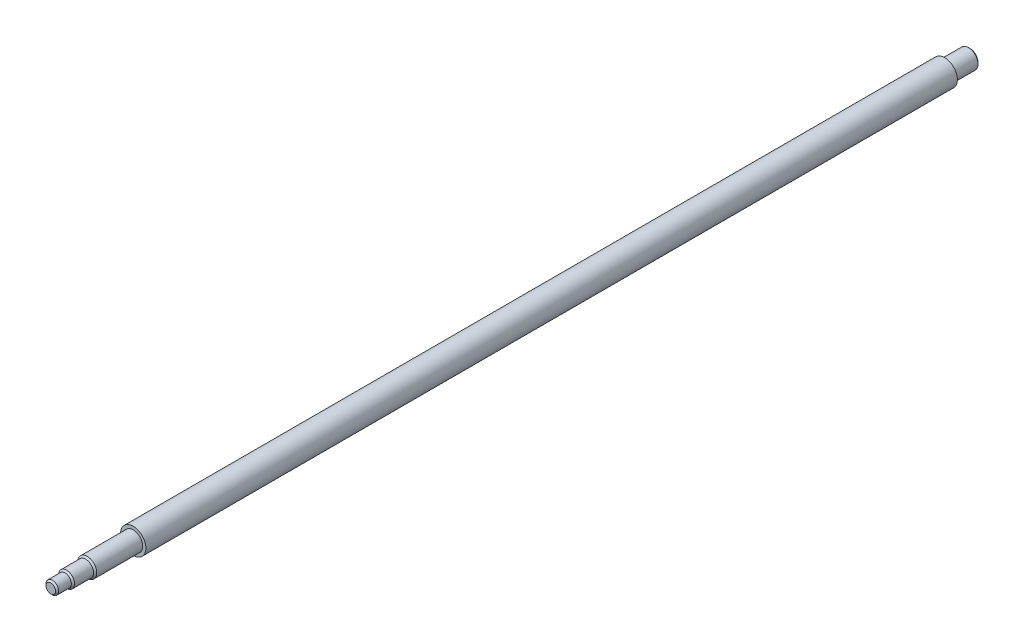
ISO-10303-21;
HEADER;
FILE_DESCRIPTION(('STEP AP214'),'2;1');
FILE_NAME('part.step','',(''),(''),'','','');
FILE_SCHEMA(('AUTOMOTIVE_DESIGN { 1 0 10303 214 1 1 1 1 }'));
ENDSEC;
DATA;
#1=APPLICATION_CONTEXT('core data for automotive mechanical design processes');
#2=APPLICATION_PROTOCOL_DEFINITION('international standard','automotive_design',2000,#1);
#3=PRODUCT_CONTEXT('',#1,'mechanical');
#4=PRODUCT('Part','Part','',(#3));
#5=PRODUCT_RELATED_PRODUCT_CATEGORY('part','',(#4));
#6=PRODUCT_DEFINITION_FORMATION('','',#4);
#7=PRODUCT_DEFINITION_CONTEXT('part definition',#1,'design');
#8=PRODUCT_DEFINITION('design','',#6,#7);
#9=PRODUCT_DEFINITION_SHAPE('','',#8);
#10=(LENGTH_UNIT() NAMED_UNIT(*) SI_UNIT(.MILLI.,.METRE.));
#11=(NAMED_UNIT(*) PLANE_ANGLE_UNIT() SI_UNIT($,.RADIAN.));
#12=(NAMED_UNIT(*) SI_UNIT($,.STERADIAN.) SOLID_ANGLE_UNIT());
#13=UNCERTAINTY_MEASURE_WITH_UNIT(LENGTH_MEASURE(1.E-05),#10,'distance_accuracy_value','');
#14=(GEOMETRIC_REPRESENTATION_CONTEXT(3) GLOBAL_UNCERTAINTY_ASSIGNED_CONTEXT((#13)) GLOBAL_UNIT_ASSIGNED_CONTEXT((#10,
#11,#12)) REPRESENTATION_CONTEXT('',''));
#15=CARTESIAN_POINT('',(0.,0.,0.));
#16=DIRECTION('',(0.,0.,1.));
#17=DIRECTION('',(1.,0.,0.));
#18=AXIS2_PLACEMENT_3D('',#15,#16,#17);
#19=CARTESIAN_POINT('',(0.,4.,0.));
#20=DIRECTION('',(0.,0.,-1.));
#21=DIRECTION('',(-1.,0.,0.));
#22=AXIS2_PLACEMENT_3D('',#19,#20,#21);
#23=PLANE('',#22);
#24=CARTESIAN_POINT('',(0.,0.,0.));
#25=DIRECTION('',(0.,0.,-1.));
#26=DIRECTION('',(-1.,0.,0.));
#27=AXIS2_PLACEMENT_3D('',#24,#25,#26);
#28=CIRCLE('',#27,3.00000000000017);
#29=CARTESIAN_POINT('',(-3.00000000000017,0.,0.));
#30=VERTEX_POINT('',#29);
#31=EDGE_CURVE('E54',#30,#30,#28,.F.);
#32=ORIENTED_EDGE('',*,*,#31,.T.);
#33=EDGE_LOOP('',(#32));
#34=FACE_BOUND('',#33,.T.);
#35=ADVANCED_FACE('F31',(#34),#23,.F.);
#36=CARTESIAN_POINT('',(0.,0.,-580.));
#37=DIRECTION('',(0.,0.,1.));
#38=DIRECTION('',(1.,0.,0.));
#39=AXIS2_PLACEMENT_3D('',#36,#37,#38);
#40=PLANE('',#39);
#41=CARTESIAN_POINT('',(0.,0.,-580.));
#42=DIRECTION('',(0.,0.,1.));
#43=DIRECTION('',(1.,0.,0.));
#44=AXIS2_PLACEMENT_3D('',#41,#42,#43);
#45=CIRCLE('',#44,5.00000000000012);
#46=CARTESIAN_POINT('',(5.00000000000012,0.,-580.));
#47=VERTEX_POINT('',#46);
#48=EDGE_CURVE('E10',#47,#47,#45,.F.);
#49=ORIENTED_EDGE('',*,*,#48,.T.);
#50=EDGE_LOOP('',(#49));
#51=FACE_BOUND('',#50,.T.);
#52=ADVANCED_FACE('F93',(#51),#40,.F.);
#53=CARTESIAN_POINT('',(0.,0.,0.));
#54=DIRECTION('',(0.,0.,1.));
#55=DIRECTION('',(1.,0.,0.));
#56=AXIS2_PLACEMENT_3D('',#53,#54,#55);
#57=CYLINDRICAL_SURFACE('',#56,6.);
#58=CARTESIAN_POINT('',(0.,0.,-579.));
#59=DIRECTION('',(0.,0.,1.));
#60=DIRECTION('',(1.,0.,0.));
#61=AXIS2_PLACEMENT_3D('',#58,#59,#60);
#62=CIRCLE('',#61,6.);
#63=CARTESIAN_POINT('',(6.,0.,-579.));
#64=VERTEX_POINT('',#63);
#65=EDGE_CURVE('E38',#64,#64,#62,.T.);
#66=ORIENTED_EDGE('',*,*,#65,.T.);
#67=EDGE_LOOP('',(#66));
#68=FACE_BOUND('',#67,.T.);
#69=CARTESIAN_POINT('',(0.,0.,-564.));
#70=DIRECTION('',(0.,0.,1.));
#71=DIRECTION('',(1.,0.,0.));
#72=AXIS2_PLACEMENT_3D('',#69,#70,#71);
#73=CIRCLE('',#72,6.);
#74=CARTESIAN_POINT('',(6.,0.,-564.));
#75=VERTEX_POINT('',#74);
#76=EDGE_CURVE('E57',#75,#75,#73,.T.);
#77=ORIENTED_EDGE('',*,*,#76,.F.);
#78=EDGE_LOOP('',(#77));
#79=FACE_BOUND('',#78,.T.);
#80=ADVANCED_FACE('F99',(#68,#79),#57,.T.);
#81=CARTESIAN_POINT('',(0.,6.,-564.));
#82=DIRECTION('',(0.,0.,1.));
#83=DIRECTION('',(1.,0.,0.));
#84=AXIS2_PLACEMENT_3D('',#81,#82,#83);
#85=PLANE('',#84);
#86=CARTESIAN_POINT('',(0.,0.,-564.));
#87=DIRECTION('',(0.,0.,1.));
#88=DIRECTION('',(1.,0.,0.));
#89=AXIS2_PLACEMENT_3D('',#86,#87,#88);
#90=CIRCLE('',#89,8.);
#91=CARTESIAN_POINT('',(8.,0.,-564.));
#92=VERTEX_POINT('',#91);
#93=EDGE_CURVE('E60',#92,#92,#90,.T.);
#94=ORIENTED_EDGE('',*,*,#93,.F.);
#95=EDGE_LOOP('',(#94));
#96=FACE_BOUND('',#95,.T.);
#97=ORIENTED_EDGE('',*,*,#76,.T.);
#98=EDGE_LOOP('',(#97));
#99=FACE_BOUND('',#98,.T.);
#100=ADVANCED_FACE('F104',(#96,#99),#85,.F.);
#101=CARTESIAN_POINT('',(0.,0.,0.));
#102=DIRECTION('',(0.,0.,1.));
#103=DIRECTION('',(1.,0.,0.));
#104=AXIS2_PLACEMENT_3D('',#101,#102,#103);
#105=CYLINDRICAL_SURFACE('',#104,7.99999999999998);
#106=CARTESIAN_POINT('',(0.,0.,-52.));
#107=DIRECTION('',(0.,0.,1.));
#108=DIRECTION('',(1.,0.,0.));
#109=AXIS2_PLACEMENT_3D('',#106,#107,#108);
#110=CIRCLE('',#109,7.99999999999995);
#111=CARTESIAN_POINT('',(7.99999999999995,0.,-52.));
#112=VERTEX_POINT('',#111);
#113=EDGE_CURVE('E63',#112,#112,#110,.T.);
#114=ORIENTED_EDGE('',*,*,#113,.F.);
#115=EDGE_LOOP('',(#114));
#116=FACE_BOUND('',#115,.T.);
#117=ORIENTED_EDGE('',*,*,#93,.T.);
#118=EDGE_LOOP('',(#117));
#119=FACE_BOUND('',#118,.T.);
#120=ADVANCED_FACE('F107',(#116,#119),#105,.T.);
#121=CARTESIAN_POINT('',(0.,7.99999999999995,-52.));
#122=DIRECTION('',(0.,0.,-1.));
#123=DIRECTION('',(-1.,0.,0.));
#124=AXIS2_PLACEMENT_3D('',#121,#122,#123);
#125=PLANE('',#124);
#126=CARTESIAN_POINT('',(0.,0.,-52.));
#127=DIRECTION('',(0.,0.,1.));
#128=DIRECTION('',(1.,0.,0.));
#129=AXIS2_PLACEMENT_3D('',#126,#127,#128);
#130=CIRCLE('',#129,6.);
#131=CARTESIAN_POINT('',(6.,0.,-52.));
#132=VERTEX_POINT('',#131);
#133=EDGE_CURVE('E66',#132,#132,#130,.T.);
#134=ORIENTED_EDGE('',*,*,#133,.F.);
#135=EDGE_LOOP('',(#134));
#136=FACE_BOUND('',#135,.T.);
#137=ORIENTED_EDGE('',*,*,#113,.T.);
#138=EDGE_LOOP('',(#137));
#139=FACE_BOUND('',#138,.T.);
#140=ADVANCED_FACE('F111',(#136,#139),#125,.F.);
#141=CARTESIAN_POINT('',(0.,0.,0.));
#142=DIRECTION('',(0.,0.,1.));
#143=DIRECTION('',(1.,0.,0.));
#144=AXIS2_PLACEMENT_3D('',#141,#142,#143);
#145=CYLINDRICAL_SURFACE('',#144,6.);
#146=CARTESIAN_POINT('',(0.,0.,-23.));
#147=DIRECTION('',(0.,0.,-1.));
#148=DIRECTION('',(-1.,0.,0.));
#149=AXIS2_PLACEMENT_3D('',#146,#147,#148);
#150=CIRCLE('',#149,6.);
#151=CARTESIAN_POINT('',(-6.,0.,-23.));
#152=VERTEX_POINT('',#151);
#153=EDGE_CURVE('E42',#152,#152,#150,.T.);
#154=ORIENTED_EDGE('',*,*,#153,.T.);
#155=EDGE_LOOP('',(#154));
#156=FACE_BOUND('',#155,.T.);
#157=ORIENTED_EDGE('',*,*,#133,.T.);
#158=EDGE_LOOP('',(#157));
#159=FACE_BOUND('',#158,.T.);
#160=ADVANCED_FACE('F115',(#156,#159),#145,.T.);
#161=CARTESIAN_POINT('',(0.,0.,0.));
#162=DIRECTION('',(0.,0.,1.));
#163=DIRECTION('',(1.,0.,0.));
#164=AXIS2_PLACEMENT_3D('',#161,#162,#163);
#165=CYLINDRICAL_SURFACE('',#164,5.);
#166=CARTESIAN_POINT('',(0.,0.,-9.99999999999996));
#167=DIRECTION('',(0.,0.,-1.));
#168=DIRECTION('',(-1.,0.,0.));
#169=AXIS2_PLACEMENT_3D('',#166,#167,#168);
#170=CIRCLE('',#169,5.);
#171=CARTESIAN_POINT('',(-5.,0.,-9.99999999999996));
#172=VERTEX_POINT('',#171);
#173=EDGE_CURVE('E46',#172,#172,#170,.T.);
#174=ORIENTED_EDGE('',*,*,#173,.T.);
#175=EDGE_LOOP('',(#174));
#176=FACE_BOUND('',#175,.T.);
#177=CARTESIAN_POINT('',(0.,0.,-22.));
#178=DIRECTION('',(0.,0.,1.));
#179=DIRECTION('',(1.,0.,0.));
#180=AXIS2_PLACEMENT_3D('',#177,#178,#179);
#181=CIRCLE('',#180,5.);
#182=CARTESIAN_POINT('',(5.,0.,-22.));
#183=VERTEX_POINT('',#182);
#184=EDGE_CURVE('E69',#183,#183,#181,.T.);
#185=ORIENTED_EDGE('',*,*,#184,.T.);
#186=EDGE_LOOP('',(#185));
#187=FACE_BOUND('',#186,.T.);
#188=ADVANCED_FACE('F119',(#176,#187),#165,.T.);
#189=CARTESIAN_POINT('',(0.,0.,0.));
#190=DIRECTION('',(0.,0.,1.));
#191=DIRECTION('',(1.,0.,0.));
#192=AXIS2_PLACEMENT_3D('',#189,#190,#191);
#193=CYLINDRICAL_SURFACE('',#192,4.);
#194=CARTESIAN_POINT('',(0.,0.,-0.999999999999845));
#195=DIRECTION('',(0.,0.,-1.));
#196=DIRECTION('',(-1.,0.,0.));
#197=AXIS2_PLACEMENT_3D('',#194,#195,#196);
#198=CIRCLE('',#197,4.);
#199=CARTESIAN_POINT('',(-4.,0.,-0.999999999999845));
#200=VERTEX_POINT('',#199);
#201=EDGE_CURVE('E51',#200,#200,#198,.T.);
#202=ORIENTED_EDGE('',*,*,#201,.T.);
#203=EDGE_LOOP('',(#202));
#204=FACE_BOUND('',#203,.T.);
#205=CARTESIAN_POINT('',(0.,0.,-9.));
#206=DIRECTION('',(0.,0.,1.));
#207=DIRECTION('',(1.,0.,0.));
#208=AXIS2_PLACEMENT_3D('',#205,#206,#207);
#209=CIRCLE('',#208,4.);
#210=CARTESIAN_POINT('',(4.,0.,-9.));
#211=VERTEX_POINT('',#210);
#212=EDGE_CURVE('E72',#211,#211,#209,.T.);
#213=ORIENTED_EDGE('',*,*,#212,.T.);
#214=EDGE_LOOP('',(#213));
#215=FACE_BOUND('',#214,.T.);
#216=ADVANCED_FACE('F76',(#204,#215),#193,.T.);
#217=CARTESIAN_POINT('',(0.,0.,0.));
#218=DIRECTION('',(0.,0.,-1.));
#219=DIRECTION('',(-1.,0.,0.));
#220=AXIS2_PLACEMENT_3D('',#217,#218,#219);
#221=CONICAL_SURFACE('',#220,3.00000000000017,0.785398163397441);
#222=ORIENTED_EDGE('',*,*,#201,.F.);
#223=EDGE_LOOP('',(#222));
#224=FACE_BOUND('',#223,.T.);
#225=ORIENTED_EDGE('',*,*,#31,.F.);
#226=EDGE_LOOP('',(#225));
#227=FACE_BOUND('',#226,.T.);
#228=ADVANCED_FACE('F81',(#224,#227),#221,.T.);
#229=CARTESIAN_POINT('',(0.,0.,-9.));
#230=DIRECTION('',(0.,0.,-1.));
#231=DIRECTION('',(-1.,0.,0.));
#232=AXIS2_PLACEMENT_3D('',#229,#230,#231);
#233=CONICAL_SURFACE('',#232,4.00000000000006,0.78539816339744);
#234=ORIENTED_EDGE('',*,*,#173,.F.);
#235=EDGE_LOOP('',(#234));
#236=FACE_BOUND('',#235,.T.);
#237=ORIENTED_EDGE('',*,*,#212,.F.);
#238=EDGE_LOOP('',(#237));
#239=FACE_BOUND('',#238,.T.);
#240=ADVANCED_FACE('F78',(#236,#239),#233,.T.);
#241=CARTESIAN_POINT('',(0.,0.,-22.));
#242=DIRECTION('',(0.,0.,-1.));
#243=DIRECTION('',(-1.,0.,0.));
#244=AXIS2_PLACEMENT_3D('',#241,#242,#243);
#245=CONICAL_SURFACE('',#244,5.00000000000006,0.785398163397438);
#246=ORIENTED_EDGE('',*,*,#153,.F.);
#247=EDGE_LOOP('',(#246));
#248=FACE_BOUND('',#247,.T.);
#249=ORIENTED_EDGE('',*,*,#184,.F.);
#250=EDGE_LOOP('',(#249));
#251=FACE_BOUND('',#250,.T.);
#252=ADVANCED_FACE('F80',(#248,#251),#245,.T.);
#253=CARTESIAN_POINT('',(0.,0.,-579.));
#254=DIRECTION('',(0.,0.,1.));
#255=DIRECTION('',(1.,0.,0.));
#256=AXIS2_PLACEMENT_3D('',#253,#254,#255);
#257=CONICAL_SURFACE('',#256,6.,0.785398163397445);
#258=ORIENTED_EDGE('',*,*,#48,.F.);
#259=EDGE_LOOP('',(#258));
#260=FACE_BOUND('',#259,.T.);
#261=ORIENTED_EDGE('',*,*,#65,.F.);
#262=EDGE_LOOP('',(#261));
#263=FACE_BOUND('',#262,.T.);
#264=ADVANCED_FACE('F33',(#260,#263),#257,.T.);
#265=CLOSED_SHELL('',(#35,#52,#80,#100,#120,#140,#160,#188,#216,#228,#240,#252,#264));
#266=MANIFOLD_SOLID_BREP('B2',#265);
#267=ADVANCED_BREP_SHAPE_REPRESENTATION('',(#18,#266),#14);
#268=SHAPE_DEFINITION_REPRESENTATION(#9,#267);
ENDSEC;
END-ISO-10303-21;
